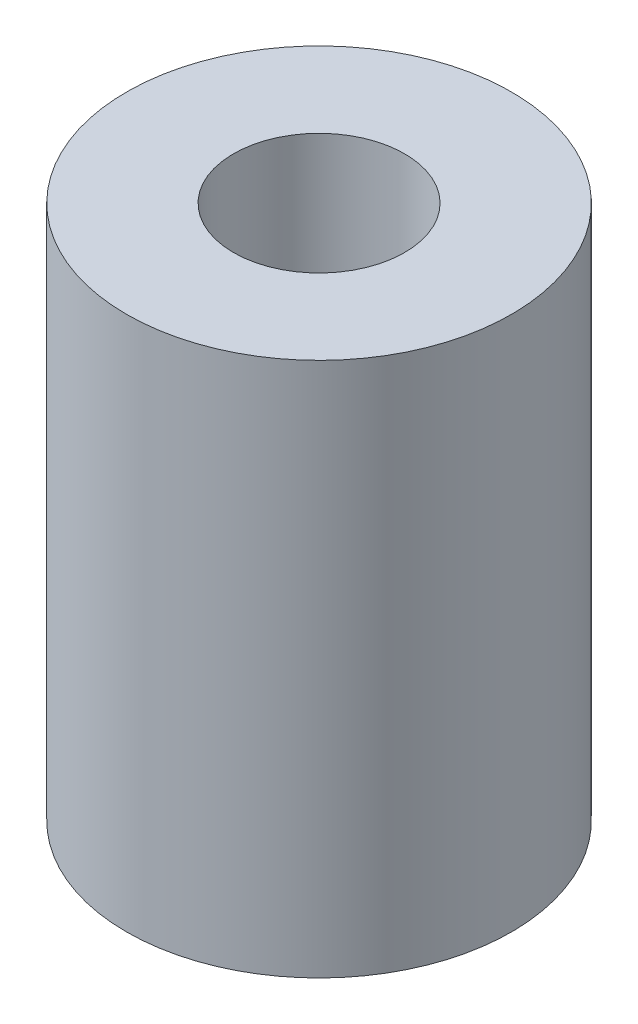
ISO-10303-21;
HEADER;
FILE_DESCRIPTION(('STEP AP214'),'2;1');
FILE_NAME('part.step','',(''),(''),'','','');
FILE_SCHEMA(('AUTOMOTIVE_DESIGN { 1 0 10303 214 1 1 1 1 }'));
ENDSEC;
DATA;
#1=APPLICATION_CONTEXT('core data for automotive mechanical design processes');
#2=APPLICATION_PROTOCOL_DEFINITION('international standard','automotive_design',2000,#1);
#3=PRODUCT_CONTEXT('',#1,'mechanical');
#4=PRODUCT('Part','Part','',(#3));
#5=PRODUCT_RELATED_PRODUCT_CATEGORY('part','',(#4));
#6=PRODUCT_DEFINITION_FORMATION('','',#4);
#7=PRODUCT_DEFINITION_CONTEXT('part definition',#1,'design');
#8=PRODUCT_DEFINITION('design','',#6,#7);
#9=PRODUCT_DEFINITION_SHAPE('','',#8);
#10=(LENGTH_UNIT() NAMED_UNIT(*) SI_UNIT(.MILLI.,.METRE.));
#11=(NAMED_UNIT(*) PLANE_ANGLE_UNIT() SI_UNIT($,.RADIAN.));
#12=(NAMED_UNIT(*) SI_UNIT($,.STERADIAN.) SOLID_ANGLE_UNIT());
#13=UNCERTAINTY_MEASURE_WITH_UNIT(LENGTH_MEASURE(1.E-05),#10,'distance_accuracy_value','');
#14=(GEOMETRIC_REPRESENTATION_CONTEXT(3) GLOBAL_UNCERTAINTY_ASSIGNED_CONTEXT((#13)) GLOBAL_UNIT_ASSIGNED_CONTEXT((#10,
#11,#12)) REPRESENTATION_CONTEXT('',''));
#15=CARTESIAN_POINT('',(0.,0.,0.));
#16=DIRECTION('',(0.,0.,1.));
#17=DIRECTION('',(1.,0.,0.));
#18=AXIS2_PLACEMENT_3D('',#15,#16,#17);
#19=CARTESIAN_POINT('',(0.,25.,0.));
#20=DIRECTION('',(0.,1.,0.));
#21=DIRECTION('',(0.,0.,1.));
#22=AXIS2_PLACEMENT_3D('',#19,#20,#21);
#23=PLANE('',#22);
#24=CARTESIAN_POINT('',(0.,25.,0.));
#25=DIRECTION('',(0.,1.,0.));
#26=DIRECTION('',(0.,0.,1.));
#27=AXIS2_PLACEMENT_3D('',#24,#25,#26);
#28=CIRCLE('',#27,9.);
#29=CARTESIAN_POINT('',(0.,25.,9.));
#30=VERTEX_POINT('',#29);
#31=EDGE_CURVE('E10',#30,#30,#28,.T.);
#32=ORIENTED_EDGE('',*,*,#31,.T.);
#33=EDGE_LOOP('',(#32));
#34=FACE_BOUND('',#33,.T.);
#35=CARTESIAN_POINT('',(0.,25.,0.));
#36=DIRECTION('',(0.,1.,0.));
#37=DIRECTION('',(0.,0.,1.));
#38=AXIS2_PLACEMENT_3D('',#35,#36,#37);
#39=CIRCLE('',#38,4.);
#40=CARTESIAN_POINT('',(0.,25.,4.));
#41=VERTEX_POINT('',#40);
#42=EDGE_CURVE('E48',#41,#41,#39,.T.);
#43=ORIENTED_EDGE('',*,*,#42,.F.);
#44=EDGE_LOOP('',(#43));
#45=FACE_BOUND('',#44,.T.);
#46=ADVANCED_FACE('F37',(#34,#45),#23,.T.);
#47=CARTESIAN_POINT('',(0.,0.,0.));
#48=DIRECTION('',(0.,1.,0.));
#49=DIRECTION('',(0.,0.,1.));
#50=AXIS2_PLACEMENT_3D('',#47,#48,#49);
#51=PLANE('',#50);
#52=CARTESIAN_POINT('',(0.,0.,0.));
#53=DIRECTION('',(0.,1.,0.));
#54=DIRECTION('',(0.,0.,1.));
#55=AXIS2_PLACEMENT_3D('',#52,#53,#54);
#56=CIRCLE('',#55,9.);
#57=CARTESIAN_POINT('',(0.,0.,9.));
#58=VERTEX_POINT('',#57);
#59=EDGE_CURVE('E41',#58,#58,#56,.T.);
#60=ORIENTED_EDGE('',*,*,#59,.F.);
#61=EDGE_LOOP('',(#60));
#62=FACE_BOUND('',#61,.T.);
#63=CARTESIAN_POINT('',(0.,0.,0.));
#64=DIRECTION('',(0.,1.,0.));
#65=DIRECTION('',(0.,0.,1.));
#66=AXIS2_PLACEMENT_3D('',#63,#64,#65);
#67=CIRCLE('',#66,4.);
#68=CARTESIAN_POINT('',(0.,0.,4.));
#69=VERTEX_POINT('',#68);
#70=EDGE_CURVE('E50',#69,#69,#67,.T.);
#71=ORIENTED_EDGE('',*,*,#70,.T.);
#72=EDGE_LOOP('',(#71));
#73=FACE_BOUND('',#72,.T.);
#74=ADVANCED_FACE('F60',(#62,#73),#51,.F.);
#75=CARTESIAN_POINT('',(0.,25.,0.));
#76=DIRECTION('',(0.,-1.,0.));
#77=DIRECTION('',(0.,0.,-1.));
#78=AXIS2_PLACEMENT_3D('',#75,#76,#77);
#79=CYLINDRICAL_SURFACE('',#78,9.);
#80=ORIENTED_EDGE('',*,*,#31,.F.);
#81=EDGE_LOOP('',(#80));
#82=FACE_BOUND('',#81,.T.);
#83=ORIENTED_EDGE('',*,*,#59,.T.);
#84=EDGE_LOOP('',(#83));
#85=FACE_BOUND('',#84,.T.);
#86=ADVANCED_FACE('F39',(#82,#85),#79,.T.);
#87=CARTESIAN_POINT('',(0.,25.,0.));
#88=DIRECTION('',(0.,-1.,0.));
#89=DIRECTION('',(0.,0.,-1.));
#90=AXIS2_PLACEMENT_3D('',#87,#88,#89);
#91=CYLINDRICAL_SURFACE('',#90,4.);
#92=ORIENTED_EDGE('',*,*,#42,.T.);
#93=EDGE_LOOP('',(#92));
#94=FACE_BOUND('',#93,.T.);
#95=ORIENTED_EDGE('',*,*,#70,.F.);
#96=EDGE_LOOP('',(#95));
#97=FACE_BOUND('',#96,.T.);
#98=ADVANCED_FACE('F56',(#94,#97),#91,.F.);
#99=CLOSED_SHELL('',(#46,#74,#86,#98));
#100=MANIFOLD_SOLID_BREP('B2',#99);
#101=ADVANCED_BREP_SHAPE_REPRESENTATION('',(#18,#100),#14);
#102=SHAPE_DEFINITION_REPRESENTATION(#9,#101);
ENDSEC;
END-ISO-10303-21;
